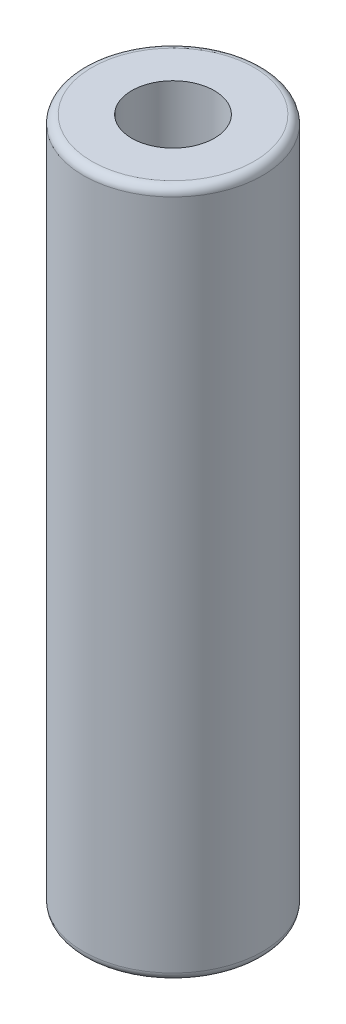
ISO-10303-21;
HEADER;
FILE_DESCRIPTION(('STEP AP214'),'2;1');
FILE_NAME('part.step','',(''),(''),'','','');
FILE_SCHEMA(('AUTOMOTIVE_DESIGN { 1 0 10303 214 1 1 1 1 }'));
ENDSEC;
DATA;
#1=APPLICATION_CONTEXT('core data for automotive mechanical design processes');
#2=APPLICATION_PROTOCOL_DEFINITION('international standard','automotive_design',2000,#1);
#3=PRODUCT_CONTEXT('',#1,'mechanical');
#4=PRODUCT('Part','Part','',(#3));
#5=PRODUCT_RELATED_PRODUCT_CATEGORY('part','',(#4));
#6=PRODUCT_DEFINITION_FORMATION('','',#4);
#7=PRODUCT_DEFINITION_CONTEXT('part definition',#1,'design');
#8=PRODUCT_DEFINITION('design','',#6,#7);
#9=PRODUCT_DEFINITION_SHAPE('','',#8);
#10=(LENGTH_UNIT() NAMED_UNIT(*) SI_UNIT(.MILLI.,.METRE.));
#11=(NAMED_UNIT(*) PLANE_ANGLE_UNIT() SI_UNIT($,.RADIAN.));
#12=(NAMED_UNIT(*) SI_UNIT($,.STERADIAN.) SOLID_ANGLE_UNIT());
#13=UNCERTAINTY_MEASURE_WITH_UNIT(LENGTH_MEASURE(1.E-05),#10,'distance_accuracy_value','');
#14=(GEOMETRIC_REPRESENTATION_CONTEXT(3) GLOBAL_UNCERTAINTY_ASSIGNED_CONTEXT((#13)) GLOBAL_UNIT_ASSIGNED_CONTEXT((#10,
#11,#12)) REPRESENTATION_CONTEXT('',''));
#15=CARTESIAN_POINT('',(0.,0.,0.));
#16=DIRECTION('',(0.,0.,1.));
#17=DIRECTION('',(1.,0.,0.));
#18=AXIS2_PLACEMENT_3D('',#15,#16,#17);
#19=CARTESIAN_POINT('',(0.,25.,0.));
#20=DIRECTION('',(0.,-1.,0.));
#21=DIRECTION('',(0.,0.,-1.));
#22=AXIS2_PLACEMENT_3D('',#19,#20,#21);
#23=CYLINDRICAL_SURFACE('',#22,3.25);
#24=CARTESIAN_POINT('',(0.,0.300000000000002,0.));
#25=DIRECTION('',(0.,1.,0.));
#26=DIRECTION('',(0.,0.,1.));
#27=AXIS2_PLACEMENT_3D('',#24,#25,#26);
#28=CIRCLE('',#27,3.25);
#29=CARTESIAN_POINT('',(0.,0.300000000000002,3.25));
#30=VERTEX_POINT('',#29);
#31=EDGE_CURVE('E40',#30,#30,#28,.T.);
#32=ORIENTED_EDGE('',*,*,#31,.T.);
#33=EDGE_LOOP('',(#32));
#34=FACE_BOUND('',#33,.T.);
#35=CARTESIAN_POINT('',(0.,24.7,0.));
#36=DIRECTION('',(0.,1.,0.));
#37=DIRECTION('',(0.,0.,1.));
#38=AXIS2_PLACEMENT_3D('',#35,#36,#37);
#39=CIRCLE('',#38,3.25);
#40=CARTESIAN_POINT('',(0.,24.7,3.25));
#41=VERTEX_POINT('',#40);
#42=EDGE_CURVE('E44',#41,#41,#39,.F.);
#43=ORIENTED_EDGE('',*,*,#42,.T.);
#44=EDGE_LOOP('',(#43));
#45=FACE_BOUND('',#44,.T.);
#46=ADVANCED_FACE('F29',(#34,#45),#23,.T.);
#47=CARTESIAN_POINT('',(0.,25.,0.));
#48=DIRECTION('',(0.,1.,0.));
#49=DIRECTION('',(0.,0.,1.));
#50=AXIS2_PLACEMENT_3D('',#47,#48,#49);
#51=PLANE('',#50);
#52=CARTESIAN_POINT('',(0.,25.,0.));
#53=DIRECTION('',(0.,1.,0.));
#54=DIRECTION('',(0.,0.,1.));
#55=AXIS2_PLACEMENT_3D('',#52,#53,#54);
#56=CIRCLE('',#55,2.95);
#57=CARTESIAN_POINT('',(0.,25.,2.95));
#58=VERTEX_POINT('',#57);
#59=EDGE_CURVE('E10',#58,#58,#56,.T.);
#60=ORIENTED_EDGE('',*,*,#59,.T.);
#61=EDGE_LOOP('',(#60));
#62=FACE_BOUND('',#61,.T.);
#63=CARTESIAN_POINT('',(0.,25.,0.));
#64=DIRECTION('',(0.,1.,0.));
#65=DIRECTION('',(0.,0.,1.));
#66=AXIS2_PLACEMENT_3D('',#63,#64,#65);
#67=CIRCLE('',#66,1.5);
#68=CARTESIAN_POINT('',(0.,25.,1.5));
#69=VERTEX_POINT('',#68);
#70=EDGE_CURVE('E50',#69,#69,#67,.T.);
#71=ORIENTED_EDGE('',*,*,#70,.F.);
#72=EDGE_LOOP('',(#71));
#73=FACE_BOUND('',#72,.T.);
#74=ADVANCED_FACE('F65',(#62,#73),#51,.T.);
#75=CARTESIAN_POINT('',(0.,0.,0.));
#76=DIRECTION('',(0.,1.,0.));
#77=DIRECTION('',(0.,0.,1.));
#78=AXIS2_PLACEMENT_3D('',#75,#76,#77);
#79=PLANE('',#78);
#80=CARTESIAN_POINT('',(0.,0.,0.));
#81=DIRECTION('',(0.,1.,0.));
#82=DIRECTION('',(0.,0.,1.));
#83=AXIS2_PLACEMENT_3D('',#80,#81,#82);
#84=CIRCLE('',#83,2.95);
#85=CARTESIAN_POINT('',(0.,0.,2.95));
#86=VERTEX_POINT('',#85);
#87=EDGE_CURVE('E36',#86,#86,#84,.F.);
#88=ORIENTED_EDGE('',*,*,#87,.T.);
#89=EDGE_LOOP('',(#88));
#90=FACE_BOUND('',#89,.T.);
#91=CARTESIAN_POINT('',(0.,0.,0.));
#92=DIRECTION('',(0.,1.,0.));
#93=DIRECTION('',(0.,0.,1.));
#94=AXIS2_PLACEMENT_3D('',#91,#92,#93);
#95=CIRCLE('',#94,1.5);
#96=CARTESIAN_POINT('',(0.,0.,1.5));
#97=VERTEX_POINT('',#96);
#98=EDGE_CURVE('E49',#97,#97,#95,.T.);
#99=ORIENTED_EDGE('',*,*,#98,.T.);
#100=EDGE_LOOP('',(#99));
#101=FACE_BOUND('',#100,.T.);
#102=ADVANCED_FACE('F56',(#90,#101),#79,.F.);
#103=CARTESIAN_POINT('',(0.,0.,0.));
#104=DIRECTION('',(0.,1.,0.));
#105=DIRECTION('',(0.,0.,1.));
#106=AXIS2_PLACEMENT_3D('',#103,#104,#105);
#107=CYLINDRICAL_SURFACE('',#106,1.5);
#108=ORIENTED_EDGE('',*,*,#98,.F.);
#109=EDGE_LOOP('',(#108));
#110=FACE_BOUND('',#109,.T.);
#111=ORIENTED_EDGE('',*,*,#70,.T.);
#112=EDGE_LOOP('',(#111));
#113=FACE_BOUND('',#112,.T.);
#114=ADVANCED_FACE('F58',(#110,#113),#107,.F.);
#115=CARTESIAN_POINT('',(0.,0.300000000000002,0.));
#116=DIRECTION('',(0.,1.,0.));
#117=DIRECTION('',(0.,0.,1.));
#118=AXIS2_PLACEMENT_3D('',#115,#116,#117);
#119=TOROIDAL_SURFACE('',#118,2.95,0.3);
#120=ORIENTED_EDGE('',*,*,#87,.F.);
#121=EDGE_LOOP('',(#120));
#122=FACE_BOUND('',#121,.T.);
#123=ORIENTED_EDGE('',*,*,#31,.F.);
#124=EDGE_LOOP('',(#123));
#125=FACE_BOUND('',#124,.T.);
#126=ADVANCED_FACE('F61',(#122,#125),#119,.T.);
#127=CARTESIAN_POINT('',(0.,24.7,0.));
#128=DIRECTION('',(0.,1.,0.));
#129=DIRECTION('',(0.,0.,1.));
#130=AXIS2_PLACEMENT_3D('',#127,#128,#129);
#131=TOROIDAL_SURFACE('',#130,2.95,0.3);
#132=ORIENTED_EDGE('',*,*,#42,.F.);
#133=EDGE_LOOP('',(#132));
#134=FACE_BOUND('',#133,.T.);
#135=ORIENTED_EDGE('',*,*,#59,.F.);
#136=EDGE_LOOP('',(#135));
#137=FACE_BOUND('',#136,.T.);
#138=ADVANCED_FACE('F31',(#134,#137),#131,.T.);
#139=CLOSED_SHELL('',(#46,#74,#102,#114,#126,#138));
#140=MANIFOLD_SOLID_BREP('B2',#139);
#141=ADVANCED_BREP_SHAPE_REPRESENTATION('',(#18,#140),#14);
#142=SHAPE_DEFINITION_REPRESENTATION(#9,#141);
ENDSEC;
END-ISO-10303-21;
